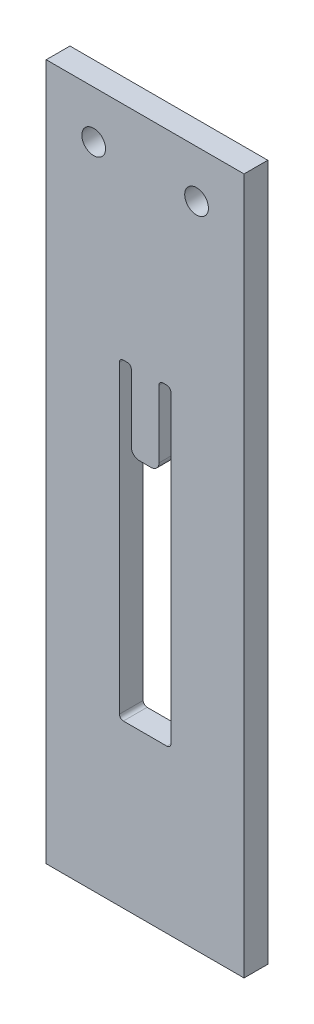
ISO-10303-21;
HEADER;
FILE_DESCRIPTION(('STEP AP214'),'2;1');
FILE_NAME('part.step','',(''),(''),'','','');
FILE_SCHEMA(('AUTOMOTIVE_DESIGN { 1 0 10303 214 1 1 1 1 }'));
ENDSEC;
DATA;
#1=APPLICATION_CONTEXT('core data for automotive mechanical design processes');
#2=APPLICATION_PROTOCOL_DEFINITION('international standard','automotive_design',2000,#1);
#3=PRODUCT_CONTEXT('',#1,'mechanical');
#4=PRODUCT('Part','Part','',(#3));
#5=PRODUCT_RELATED_PRODUCT_CATEGORY('part','',(#4));
#6=PRODUCT_DEFINITION_FORMATION('','',#4);
#7=PRODUCT_DEFINITION_CONTEXT('part definition',#1,'design');
#8=PRODUCT_DEFINITION('design','',#6,#7);
#9=PRODUCT_DEFINITION_SHAPE('','',#8);
#10=(LENGTH_UNIT() NAMED_UNIT(*) SI_UNIT(.MILLI.,.METRE.));
#11=(NAMED_UNIT(*) PLANE_ANGLE_UNIT() SI_UNIT($,.RADIAN.));
#12=(NAMED_UNIT(*) SI_UNIT($,.STERADIAN.) SOLID_ANGLE_UNIT());
#13=UNCERTAINTY_MEASURE_WITH_UNIT(LENGTH_MEASURE(1.E-05),#10,'distance_accuracy_value','');
#14=(GEOMETRIC_REPRESENTATION_CONTEXT(3) GLOBAL_UNCERTAINTY_ASSIGNED_CONTEXT((#13)) GLOBAL_UNIT_ASSIGNED_CONTEXT((#10,
#11,#12)) REPRESENTATION_CONTEXT('',''));
#15=CARTESIAN_POINT('',(0.,0.,0.));
#16=DIRECTION('',(0.,0.,1.));
#17=DIRECTION('',(1.,0.,0.));
#18=AXIS2_PLACEMENT_3D('',#15,#16,#17);
#19=CARTESIAN_POINT('',(0.,0.,3.));
#20=DIRECTION('',(1.,0.,0.));
#21=DIRECTION('',(0.,1.,0.));
#22=AXIS2_PLACEMENT_3D('',#19,#20,#21);
#23=PLANE('',#22);
#24=DIRECTION('',(0.,-1.,0.));
#25=VECTOR('',#24,1.);
#26=CARTESIAN_POINT('',(0.,0.,0.));
#27=LINE('',#26,#25);
#28=CARTESIAN_POINT('',(0.,88.,0.));
#29=VERTEX_POINT('',#28);
#30=CARTESIAN_POINT('',(0.,0.,0.));
#31=VERTEX_POINT('',#30);
#32=EDGE_CURVE('E224',#29,#31,#27,.T.);
#33=ORIENTED_EDGE('',*,*,#32,.T.);
#34=DIRECTION('',(0.,0.,-1.));
#35=VECTOR('',#34,1.);
#36=CARTESIAN_POINT('',(0.,0.,3.));
#37=LINE('',#36,#35);
#38=CARTESIAN_POINT('',(0.,0.,3.));
#39=VERTEX_POINT('',#38);
#40=EDGE_CURVE('E263',#39,#31,#37,.T.);
#41=ORIENTED_EDGE('',*,*,#40,.F.);
#42=DIRECTION('',(0.,-1.,0.));
#43=VECTOR('',#42,1.);
#44=CARTESIAN_POINT('',(0.,0.,3.));
#45=LINE('',#44,#43);
#46=CARTESIAN_POINT('',(0.,88.,3.));
#47=VERTEX_POINT('',#46);
#48=EDGE_CURVE('E230',#47,#39,#45,.T.);
#49=ORIENTED_EDGE('',*,*,#48,.F.);
#50=DIRECTION('',(0.,0.,-1.));
#51=VECTOR('',#50,1.);
#52=CARTESIAN_POINT('',(0.,88.,3.));
#53=LINE('',#52,#51);
#54=EDGE_CURVE('E247',#47,#29,#53,.T.);
#55=ORIENTED_EDGE('',*,*,#54,.T.);
#56=EDGE_LOOP('',(#33,#41,#49,#55));
#57=FACE_BOUND('',#56,.T.);
#58=ADVANCED_FACE('F38',(#57),#23,.F.);
#59=CARTESIAN_POINT('',(0.,0.,3.));
#60=DIRECTION('',(0.,1.,0.));
#61=DIRECTION('',(0.,0.,1.));
#62=AXIS2_PLACEMENT_3D('',#59,#60,#61);
#63=PLANE('',#62);
#64=DIRECTION('',(1.,0.,0.));
#65=VECTOR('',#64,1.);
#66=CARTESIAN_POINT('',(0.,0.,0.));
#67=LINE('',#66,#65);
#68=CARTESIAN_POINT('',(25.,0.,0.));
#69=VERTEX_POINT('',#68);
#70=EDGE_CURVE('E250',#31,#69,#67,.T.);
#71=ORIENTED_EDGE('',*,*,#70,.T.);
#72=DIRECTION('',(0.,0.,-1.));
#73=VECTOR('',#72,1.);
#74=CARTESIAN_POINT('',(25.,0.,3.));
#75=LINE('',#74,#73);
#76=CARTESIAN_POINT('',(25.,0.,3.));
#77=VERTEX_POINT('',#76);
#78=EDGE_CURVE('E260',#77,#69,#75,.T.);
#79=ORIENTED_EDGE('',*,*,#78,.F.);
#80=DIRECTION('',(1.,0.,0.));
#81=VECTOR('',#80,1.);
#82=CARTESIAN_POINT('',(0.,0.,3.));
#83=LINE('',#82,#81);
#84=EDGE_CURVE('E235',#39,#77,#83,.T.);
#85=ORIENTED_EDGE('',*,*,#84,.F.);
#86=ORIENTED_EDGE('',*,*,#40,.T.);
#87=EDGE_LOOP('',(#71,#79,#85,#86));
#88=FACE_BOUND('',#87,.T.);
#89=ADVANCED_FACE('F444',(#88),#63,.F.);
#90=CARTESIAN_POINT('',(25.,0.,3.));
#91=DIRECTION('',(-1.,0.,0.));
#92=DIRECTION('',(0.,-1.,0.));
#93=AXIS2_PLACEMENT_3D('',#90,#91,#92);
#94=PLANE('',#93);
#95=DIRECTION('',(0.,1.,0.));
#96=VECTOR('',#95,1.);
#97=CARTESIAN_POINT('',(25.,0.,0.));
#98=LINE('',#97,#96);
#99=CARTESIAN_POINT('',(25.,88.,0.));
#100=VERTEX_POINT('',#99);
#101=EDGE_CURVE('E252',#69,#100,#98,.T.);
#102=ORIENTED_EDGE('',*,*,#101,.T.);
#103=DIRECTION('',(0.,0.,-1.));
#104=VECTOR('',#103,1.);
#105=CARTESIAN_POINT('',(25.,88.,3.));
#106=LINE('',#105,#104);
#107=CARTESIAN_POINT('',(25.,88.,3.));
#108=VERTEX_POINT('',#107);
#109=EDGE_CURVE('E257',#108,#100,#106,.T.);
#110=ORIENTED_EDGE('',*,*,#109,.F.);
#111=DIRECTION('',(0.,1.,0.));
#112=VECTOR('',#111,1.);
#113=CARTESIAN_POINT('',(25.,0.,3.));
#114=LINE('',#113,#112);
#115=EDGE_CURVE('E240',#77,#108,#114,.T.);
#116=ORIENTED_EDGE('',*,*,#115,.F.);
#117=ORIENTED_EDGE('',*,*,#78,.T.);
#118=EDGE_LOOP('',(#102,#110,#116,#117));
#119=FACE_BOUND('',#118,.T.);
#120=ADVANCED_FACE('F449',(#119),#94,.F.);
#121=CARTESIAN_POINT('',(0.,88.,3.));
#122=DIRECTION('',(0.,-1.,0.));
#123=DIRECTION('',(0.,0.,-1.));
#124=AXIS2_PLACEMENT_3D('',#121,#122,#123);
#125=PLANE('',#124);
#126=DIRECTION('',(-1.,0.,0.));
#127=VECTOR('',#126,1.);
#128=CARTESIAN_POINT('',(0.,88.,0.));
#129=LINE('',#128,#127);
#130=EDGE_CURVE('E236',#100,#29,#129,.T.);
#131=ORIENTED_EDGE('',*,*,#130,.T.);
#132=ORIENTED_EDGE('',*,*,#54,.F.);
#133=DIRECTION('',(-1.,0.,0.));
#134=VECTOR('',#133,1.);
#135=CARTESIAN_POINT('',(0.,88.,3.));
#136=LINE('',#135,#134);
#137=EDGE_CURVE('E243',#108,#47,#136,.T.);
#138=ORIENTED_EDGE('',*,*,#137,.F.);
#139=ORIENTED_EDGE('',*,*,#109,.T.);
#140=EDGE_LOOP('',(#131,#132,#138,#139));
#141=FACE_BOUND('',#140,.T.);
#142=ADVANCED_FACE('F465',(#141),#125,.F.);
#143=CARTESIAN_POINT('',(0.,0.,3.));
#144=DIRECTION('',(0.,0.,-1.));
#145=DIRECTION('',(-1.,0.,0.));
#146=AXIS2_PLACEMENT_3D('',#143,#144,#145);
#147=PLANE('',#146);
#148=DIRECTION('',(0.,1.,0.));
#149=VECTOR('',#148,1.);
#150=CARTESIAN_POINT('',(15.75,21.,3.));
#151=LINE('',#150,#149);
#152=CARTESIAN_POINT('',(15.75,21.,3.));
#153=VERTEX_POINT('',#152);
#154=CARTESIAN_POINT('',(15.75,59.5,3.));
#155=VERTEX_POINT('',#154);
#156=EDGE_CURVE('E185',#153,#155,#151,.T.);
#157=ORIENTED_EDGE('',*,*,#156,.F.);
#158=CARTESIAN_POINT('',(15.25,21.,3.));
#159=DIRECTION('',(0.,0.,1.));
#160=DIRECTION('',(-1.,0.,0.));
#161=AXIS2_PLACEMENT_3D('',#158,#159,#160);
#162=CIRCLE('',#161,0.500000000000001);
#163=CARTESIAN_POINT('',(15.25,20.5,3.));
#164=VERTEX_POINT('',#163);
#165=EDGE_CURVE('E52',#164,#153,#162,.T.);
#166=ORIENTED_EDGE('',*,*,#165,.F.);
#167=DIRECTION('',(1.,0.,0.));
#168=VECTOR('',#167,1.);
#169=CARTESIAN_POINT('',(9.74999999999998,20.5,3.));
#170=LINE('',#169,#168);
#171=CARTESIAN_POINT('',(9.74999999999998,20.5,3.));
#172=VERTEX_POINT('',#171);
#173=EDGE_CURVE('E349',#172,#164,#170,.T.);
#174=ORIENTED_EDGE('',*,*,#173,.F.);
#175=CARTESIAN_POINT('',(9.74999999999998,21.,3.));
#176=DIRECTION('',(0.,0.,1.));
#177=DIRECTION('',(1.,0.,0.));
#178=AXIS2_PLACEMENT_3D('',#175,#176,#177);
#179=CIRCLE('',#178,0.5);
#180=CARTESIAN_POINT('',(9.24999999999998,21.,3.));
#181=VERTEX_POINT('',#180);
#182=EDGE_CURVE('E307',#181,#172,#179,.T.);
#183=ORIENTED_EDGE('',*,*,#182,.F.);
#184=DIRECTION('',(0.,-1.,0.));
#185=VECTOR('',#184,1.);
#186=CARTESIAN_POINT('',(9.24999999999998,21.,3.));
#187=LINE('',#186,#185);
#188=CARTESIAN_POINT('',(9.24999999999998,59.5,3.));
#189=VERTEX_POINT('',#188);
#190=EDGE_CURVE('E354',#189,#181,#187,.T.);
#191=ORIENTED_EDGE('',*,*,#190,.F.);
#192=CARTESIAN_POINT('',(9.74999999999998,59.5,3.));
#193=DIRECTION('',(0.,0.,1.));
#194=DIRECTION('',(-1.,0.,0.));
#195=AXIS2_PLACEMENT_3D('',#192,#193,#194);
#196=CIRCLE('',#195,0.5);
#197=CARTESIAN_POINT('',(9.74999999999998,60.,3.));
#198=VERTEX_POINT('',#197);
#199=EDGE_CURVE('E326',#198,#189,#196,.T.);
#200=ORIENTED_EDGE('',*,*,#199,.F.);
#201=DIRECTION('',(-1.,0.,0.));
#202=VECTOR('',#201,1.);
#203=CARTESIAN_POINT('',(9.74999999999998,60.,3.));
#204=LINE('',#203,#202);
#205=CARTESIAN_POINT('',(10.25,60.,3.));
#206=VERTEX_POINT('',#205);
#207=EDGE_CURVE('E373',#206,#198,#204,.T.);
#208=ORIENTED_EDGE('',*,*,#207,.F.);
#209=CARTESIAN_POINT('',(10.25,59.5,3.));
#210=DIRECTION('',(0.,0.,1.));
#211=DIRECTION('',(-1.,0.,0.));
#212=AXIS2_PLACEMENT_3D('',#209,#210,#211);
#213=CIRCLE('',#212,0.5);
#214=CARTESIAN_POINT('',(10.75,59.5,3.));
#215=VERTEX_POINT('',#214);
#216=EDGE_CURVE('E378',#215,#206,#213,.T.);
#217=ORIENTED_EDGE('',*,*,#216,.F.);
#218=DIRECTION('',(0.,1.,0.));
#219=VECTOR('',#218,1.);
#220=CARTESIAN_POINT('',(10.75,59.5,3.));
#221=LINE('',#220,#219);
#222=CARTESIAN_POINT('',(10.75,51.,3.));
#223=VERTEX_POINT('',#222);
#224=EDGE_CURVE('E386',#223,#215,#221,.T.);
#225=ORIENTED_EDGE('',*,*,#224,.F.);
#226=CARTESIAN_POINT('',(11.75,51.,3.));
#227=DIRECTION('',(0.,0.,-1.));
#228=DIRECTION('',(1.,0.,0.));
#229=AXIS2_PLACEMENT_3D('',#226,#227,#228);
#230=CIRCLE('',#229,0.999999999999999);
#231=CARTESIAN_POINT('',(11.75,50.,3.));
#232=VERTEX_POINT('',#231);
#233=EDGE_CURVE('E390',#232,#223,#230,.T.);
#234=ORIENTED_EDGE('',*,*,#233,.F.);
#235=DIRECTION('',(-1.,0.,0.));
#236=VECTOR('',#235,1.);
#237=CARTESIAN_POINT('',(11.75,50.,3.));
#238=LINE('',#237,#236);
#239=CARTESIAN_POINT('',(13.25,50.,3.));
#240=VERTEX_POINT('',#239);
#241=EDGE_CURVE('E395',#240,#232,#238,.T.);
#242=ORIENTED_EDGE('',*,*,#241,.F.);
#243=CARTESIAN_POINT('',(13.25,51.,3.));
#244=DIRECTION('',(0.,0.,-1.));
#245=DIRECTION('',(1.,0.,0.));
#246=AXIS2_PLACEMENT_3D('',#243,#244,#245);
#247=CIRCLE('',#246,1.);
#248=CARTESIAN_POINT('',(14.25,51.,3.));
#249=VERTEX_POINT('',#248);
#250=EDGE_CURVE('E400',#249,#240,#247,.T.);
#251=ORIENTED_EDGE('',*,*,#250,.F.);
#252=DIRECTION('',(0.,-1.,0.));
#253=VECTOR('',#252,1.);
#254=CARTESIAN_POINT('',(14.25,59.5,3.));
#255=LINE('',#254,#253);
#256=CARTESIAN_POINT('',(14.25,59.5,3.));
#257=VERTEX_POINT('',#256);
#258=EDGE_CURVE('E405',#257,#249,#255,.T.);
#259=ORIENTED_EDGE('',*,*,#258,.F.);
#260=CARTESIAN_POINT('',(14.75,59.5,3.));
#261=DIRECTION('',(0.,0.,1.));
#262=DIRECTION('',(1.,0.,0.));
#263=AXIS2_PLACEMENT_3D('',#260,#261,#262);
#264=CIRCLE('',#263,0.5);
#265=CARTESIAN_POINT('',(14.75,60.,3.));
#266=VERTEX_POINT('',#265);
#267=EDGE_CURVE('E199',#266,#257,#264,.T.);
#268=ORIENTED_EDGE('',*,*,#267,.F.);
#269=DIRECTION('',(-1.,0.,0.));
#270=VECTOR('',#269,1.);
#271=CARTESIAN_POINT('',(14.75,60.,3.));
#272=LINE('',#271,#270);
#273=CARTESIAN_POINT('',(15.25,60.,3.));
#274=VERTEX_POINT('',#273);
#275=EDGE_CURVE('E194',#274,#266,#272,.T.);
#276=ORIENTED_EDGE('',*,*,#275,.F.);
#277=CARTESIAN_POINT('',(15.25,59.5,3.));
#278=DIRECTION('',(0.,0.,1.));
#279=DIRECTION('',(-1.,0.,0.));
#280=AXIS2_PLACEMENT_3D('',#277,#278,#279);
#281=CIRCLE('',#280,0.499999999999997);
#282=EDGE_CURVE('E176',#155,#274,#281,.T.);
#283=ORIENTED_EDGE('',*,*,#282,.F.);
#284=EDGE_LOOP('',(#157,#166,#174,#183,#191,#200,#208,#217,#225,#234,#242,#251,#259,#268,#276,#283));
#285=FACE_BOUND('',#284,.T.);
#286=CARTESIAN_POINT('',(5.99999999999999,82.,3.));
#287=DIRECTION('',(0.,0.,1.));
#288=DIRECTION('',(1.,0.,0.));
#289=AXIS2_PLACEMENT_3D('',#286,#287,#288);
#290=CIRCLE('',#289,1.5);
#291=CARTESIAN_POINT('',(7.49999999999999,82.,3.));
#292=VERTEX_POINT('',#291);
#293=EDGE_CURVE('E214',#292,#292,#290,.T.);
#294=ORIENTED_EDGE('',*,*,#293,.F.);
#295=EDGE_LOOP('',(#294));
#296=FACE_BOUND('',#295,.T.);
#297=CARTESIAN_POINT('',(19.,82.,3.));
#298=DIRECTION('',(0.,0.,1.));
#299=DIRECTION('',(1.,0.,0.));
#300=AXIS2_PLACEMENT_3D('',#297,#298,#299);
#301=CIRCLE('',#300,1.5);
#302=CARTESIAN_POINT('',(20.5,82.,3.));
#303=VERTEX_POINT('',#302);
#304=EDGE_CURVE('E225',#303,#303,#301,.T.);
#305=ORIENTED_EDGE('',*,*,#304,.F.);
#306=EDGE_LOOP('',(#305));
#307=FACE_BOUND('',#306,.T.);
#308=ORIENTED_EDGE('',*,*,#48,.T.);
#309=ORIENTED_EDGE('',*,*,#84,.T.);
#310=ORIENTED_EDGE('',*,*,#115,.T.);
#311=ORIENTED_EDGE('',*,*,#137,.T.);
#312=EDGE_LOOP('',(#308,#309,#310,#311));
#313=FACE_BOUND('',#312,.T.);
#314=ADVANCED_FACE('F190',(#285,#296,#307,#313),#147,.F.);
#315=CARTESIAN_POINT('',(0.,0.,0.));
#316=DIRECTION('',(0.,0.,-1.));
#317=DIRECTION('',(-1.,0.,0.));
#318=AXIS2_PLACEMENT_3D('',#315,#316,#317);
#319=PLANE('',#318);
#320=CARTESIAN_POINT('',(15.25,21.,0.));
#321=DIRECTION('',(0.,0.,-1.));
#322=DIRECTION('',(-1.,0.,0.));
#323=AXIS2_PLACEMENT_3D('',#320,#321,#322);
#324=CIRCLE('',#323,0.500000000000001);
#325=CARTESIAN_POINT('',(15.75,21.,0.));
#326=VERTEX_POINT('',#325);
#327=CARTESIAN_POINT('',(15.25,20.5,0.));
#328=VERTEX_POINT('',#327);
#329=EDGE_CURVE('E12',#326,#328,#324,.T.);
#330=ORIENTED_EDGE('',*,*,#329,.F.);
#331=DIRECTION('',(0.,-1.,0.));
#332=VECTOR('',#331,1.);
#333=CARTESIAN_POINT('',(15.75,0.,0.));
#334=LINE('',#333,#332);
#335=CARTESIAN_POINT('',(15.75,59.5,0.));
#336=VERTEX_POINT('',#335);
#337=EDGE_CURVE('E266',#336,#326,#334,.T.);
#338=ORIENTED_EDGE('',*,*,#337,.F.);
#339=CARTESIAN_POINT('',(15.25,59.5,0.));
#340=DIRECTION('',(0.,0.,-1.));
#341=DIRECTION('',(-1.,0.,0.));
#342=AXIS2_PLACEMENT_3D('',#339,#340,#341);
#343=CIRCLE('',#342,0.499999999999997);
#344=CARTESIAN_POINT('',(15.25,60.,0.));
#345=VERTEX_POINT('',#344);
#346=EDGE_CURVE('E179',#345,#336,#343,.T.);
#347=ORIENTED_EDGE('',*,*,#346,.F.);
#348=DIRECTION('',(1.,0.,0.));
#349=VECTOR('',#348,1.);
#350=CARTESIAN_POINT('',(8.32667268468829E-13,60.0000000000002,0.));
#351=LINE('',#350,#349);
#352=CARTESIAN_POINT('',(14.75,60.,0.));
#353=VERTEX_POINT('',#352);
#354=EDGE_CURVE('E269',#353,#345,#351,.T.);
#355=ORIENTED_EDGE('',*,*,#354,.F.);
#356=CARTESIAN_POINT('',(14.75,59.5,0.));
#357=DIRECTION('',(0.,0.,-1.));
#358=DIRECTION('',(-1.,0.,0.));
#359=AXIS2_PLACEMENT_3D('',#356,#357,#358);
#360=CIRCLE('',#359,0.5);
#361=CARTESIAN_POINT('',(14.25,59.5,0.));
#362=VERTEX_POINT('',#361);
#363=EDGE_CURVE('E271',#362,#353,#360,.T.);
#364=ORIENTED_EDGE('',*,*,#363,.F.);
#365=DIRECTION('',(0.,1.,0.));
#366=VECTOR('',#365,1.);
#367=CARTESIAN_POINT('',(14.25,0.,0.));
#368=LINE('',#367,#366);
#369=CARTESIAN_POINT('',(14.25,51.,0.));
#370=VERTEX_POINT('',#369);
#371=EDGE_CURVE('E273',#370,#362,#368,.T.);
#372=ORIENTED_EDGE('',*,*,#371,.F.);
#373=CARTESIAN_POINT('',(13.25,51.,0.));
#374=DIRECTION('',(0.,0.,-1.));
#375=DIRECTION('',(-1.,0.,0.));
#376=AXIS2_PLACEMENT_3D('',#373,#374,#375);
#377=CIRCLE('',#376,1.);
#378=CARTESIAN_POINT('',(13.25,50.,0.));
#379=VERTEX_POINT('',#378);
#380=EDGE_CURVE('E275',#379,#370,#377,.F.);
#381=ORIENTED_EDGE('',*,*,#380,.F.);
#382=DIRECTION('',(1.,0.,0.));
#383=VECTOR('',#382,1.);
#384=CARTESIAN_POINT('',(0.,50.,0.));
#385=LINE('',#384,#383);
#386=CARTESIAN_POINT('',(11.75,50.,0.));
#387=VERTEX_POINT('',#386);
#388=EDGE_CURVE('E277',#387,#379,#385,.T.);
#389=ORIENTED_EDGE('',*,*,#388,.F.);
#390=CARTESIAN_POINT('',(11.75,51.,0.));
#391=DIRECTION('',(0.,0.,-1.));
#392=DIRECTION('',(-1.,0.,0.));
#393=AXIS2_PLACEMENT_3D('',#390,#391,#392);
#394=CIRCLE('',#393,0.999999999999999);
#395=CARTESIAN_POINT('',(10.75,51.,0.));
#396=VERTEX_POINT('',#395);
#397=EDGE_CURVE('E279',#396,#387,#394,.F.);
#398=ORIENTED_EDGE('',*,*,#397,.F.);
#399=DIRECTION('',(0.,-1.,0.));
#400=VECTOR('',#399,1.);
#401=CARTESIAN_POINT('',(10.75,0.,0.));
#402=LINE('',#401,#400);
#403=CARTESIAN_POINT('',(10.75,59.5,0.));
#404=VERTEX_POINT('',#403);
#405=EDGE_CURVE('E281',#404,#396,#402,.T.);
#406=ORIENTED_EDGE('',*,*,#405,.F.);
#407=CARTESIAN_POINT('',(10.25,59.5,0.));
#408=DIRECTION('',(0.,0.,-1.));
#409=DIRECTION('',(-1.,0.,0.));
#410=AXIS2_PLACEMENT_3D('',#407,#408,#409);
#411=CIRCLE('',#410,0.5);
#412=CARTESIAN_POINT('',(10.25,60.,0.));
#413=VERTEX_POINT('',#412);
#414=EDGE_CURVE('E283',#413,#404,#411,.T.);
#415=ORIENTED_EDGE('',*,*,#414,.F.);
#416=DIRECTION('',(1.,0.,0.));
#417=VECTOR('',#416,1.);
#418=CARTESIAN_POINT('',(0.,60.,0.));
#419=LINE('',#418,#417);
#420=CARTESIAN_POINT('',(9.74999999999998,60.,0.));
#421=VERTEX_POINT('',#420);
#422=EDGE_CURVE('E285',#421,#413,#419,.T.);
#423=ORIENTED_EDGE('',*,*,#422,.F.);
#424=CARTESIAN_POINT('',(9.74999999999998,59.5,0.));
#425=DIRECTION('',(0.,0.,-1.));
#426=DIRECTION('',(-1.,0.,0.));
#427=AXIS2_PLACEMENT_3D('',#424,#425,#426);
#428=CIRCLE('',#427,0.5);
#429=CARTESIAN_POINT('',(9.24999999999998,59.5,0.));
#430=VERTEX_POINT('',#429);
#431=EDGE_CURVE('E287',#430,#421,#428,.T.);
#432=ORIENTED_EDGE('',*,*,#431,.F.);
#433=DIRECTION('',(0.,1.,0.));
#434=VECTOR('',#433,1.);
#435=CARTESIAN_POINT('',(9.24999999999998,0.,0.));
#436=LINE('',#435,#434);
#437=CARTESIAN_POINT('',(9.24999999999998,21.,0.));
#438=VERTEX_POINT('',#437);
#439=EDGE_CURVE('E289',#438,#430,#436,.T.);
#440=ORIENTED_EDGE('',*,*,#439,.F.);
#441=CARTESIAN_POINT('',(9.74999999999998,21.,0.));
#442=DIRECTION('',(0.,0.,-1.));
#443=DIRECTION('',(-1.,0.,0.));
#444=AXIS2_PLACEMENT_3D('',#441,#442,#443);
#445=CIRCLE('',#444,0.5);
#446=CARTESIAN_POINT('',(9.74999999999998,20.5,0.));
#447=VERTEX_POINT('',#446);
#448=EDGE_CURVE('E291',#447,#438,#445,.T.);
#449=ORIENTED_EDGE('',*,*,#448,.F.);
#450=DIRECTION('',(-1.,0.,0.));
#451=VECTOR('',#450,1.);
#452=CARTESIAN_POINT('',(0.,20.5,0.));
#453=LINE('',#452,#451);
#454=EDGE_CURVE('E45',#328,#447,#453,.T.);
#455=ORIENTED_EDGE('',*,*,#454,.F.);
#456=EDGE_LOOP('',(#330,#338,#347,#355,#364,#372,#381,#389,#398,#406,#415,#423,#432,#440,#449,#455));
#457=FACE_BOUND('',#456,.T.);
#458=CARTESIAN_POINT('',(5.99999999999999,82.,0.));
#459=DIRECTION('',(0.,0.,1.));
#460=DIRECTION('',(1.,0.,0.));
#461=AXIS2_PLACEMENT_3D('',#458,#459,#460);
#462=CIRCLE('',#461,1.5);
#463=CARTESIAN_POINT('',(7.49999999999999,82.,0.));
#464=VERTEX_POINT('',#463);
#465=EDGE_CURVE('E219',#464,#464,#462,.T.);
#466=ORIENTED_EDGE('',*,*,#465,.T.);
#467=EDGE_LOOP('',(#466));
#468=FACE_BOUND('',#467,.T.);
#469=CARTESIAN_POINT('',(19.,82.,0.));
#470=DIRECTION('',(0.,0.,1.));
#471=DIRECTION('',(1.,0.,0.));
#472=AXIS2_PLACEMENT_3D('',#469,#470,#471);
#473=CIRCLE('',#472,1.5);
#474=CARTESIAN_POINT('',(20.5,82.,0.));
#475=VERTEX_POINT('',#474);
#476=EDGE_CURVE('E222',#475,#475,#473,.T.);
#477=ORIENTED_EDGE('',*,*,#476,.T.);
#478=EDGE_LOOP('',(#477));
#479=FACE_BOUND('',#478,.T.);
#480=ORIENTED_EDGE('',*,*,#32,.F.);
#481=ORIENTED_EDGE('',*,*,#130,.F.);
#482=ORIENTED_EDGE('',*,*,#101,.F.);
#483=ORIENTED_EDGE('',*,*,#70,.F.);
#484=EDGE_LOOP('',(#480,#481,#482,#483));
#485=FACE_BOUND('',#484,.T.);
#486=ADVANCED_FACE('F312',(#457,#468,#479,#485),#319,.T.);
#487=CARTESIAN_POINT('',(19.,82.,0.));
#488=DIRECTION('',(0.,0.,1.));
#489=DIRECTION('',(1.,0.,0.));
#490=AXIS2_PLACEMENT_3D('',#487,#488,#489);
#491=CYLINDRICAL_SURFACE('',#490,1.5);
#492=ORIENTED_EDGE('',*,*,#476,.F.);
#493=EDGE_LOOP('',(#492));
#494=FACE_BOUND('',#493,.T.);
#495=ORIENTED_EDGE('',*,*,#304,.T.);
#496=EDGE_LOOP('',(#495));
#497=FACE_BOUND('',#496,.T.);
#498=ADVANCED_FACE('F439',(#494,#497),#491,.F.);
#499=CARTESIAN_POINT('',(5.99999999999999,82.,0.));
#500=DIRECTION('',(0.,0.,1.));
#501=DIRECTION('',(1.,0.,0.));
#502=AXIS2_PLACEMENT_3D('',#499,#500,#501);
#503=CYLINDRICAL_SURFACE('',#502,1.5);
#504=ORIENTED_EDGE('',*,*,#465,.F.);
#505=EDGE_LOOP('',(#504));
#506=FACE_BOUND('',#505,.T.);
#507=ORIENTED_EDGE('',*,*,#293,.T.);
#508=EDGE_LOOP('',(#507));
#509=FACE_BOUND('',#508,.T.);
#510=ADVANCED_FACE('F432',(#506,#509),#503,.F.);
#511=CARTESIAN_POINT('',(15.25,21.,-7.));
#512=DIRECTION('',(0.,0.,1.));
#513=DIRECTION('',(1.,0.,0.));
#514=AXIS2_PLACEMENT_3D('',#511,#512,#513);
#515=CYLINDRICAL_SURFACE('',#514,0.500000000000001);
#516=ORIENTED_EDGE('',*,*,#329,.T.);
#517=DIRECTION('',(0.,0.,1.));
#518=VECTOR('',#517,1.);
#519=CARTESIAN_POINT('',(15.25,20.5,-7.));
#520=LINE('',#519,#518);
#521=EDGE_CURVE('E220',#328,#164,#520,.T.);
#522=ORIENTED_EDGE('',*,*,#521,.T.);
#523=ORIENTED_EDGE('',*,*,#165,.T.);
#524=DIRECTION('',(0.,0.,1.));
#525=VECTOR('',#524,1.);
#526=CARTESIAN_POINT('',(15.75,21.,-7.));
#527=LINE('',#526,#525);
#528=EDGE_CURVE('E182',#326,#153,#527,.T.);
#529=ORIENTED_EDGE('',*,*,#528,.F.);
#530=EDGE_LOOP('',(#516,#522,#523,#529));
#531=FACE_BOUND('',#530,.T.);
#532=ADVANCED_FACE('F430',(#531),#515,.F.);
#533=CARTESIAN_POINT('',(9.74999999999998,20.5,-7.));
#534=DIRECTION('',(0.,-1.,0.));
#535=DIRECTION('',(0.,0.,-1.));
#536=AXIS2_PLACEMENT_3D('',#533,#534,#535);
#537=PLANE('',#536);
#538=ORIENTED_EDGE('',*,*,#454,.T.);
#539=DIRECTION('',(0.,0.,1.));
#540=VECTOR('',#539,1.);
#541=CARTESIAN_POINT('',(9.74999999999998,20.5,-7.));
#542=LINE('',#541,#540);
#543=EDGE_CURVE('E298',#447,#172,#542,.T.);
#544=ORIENTED_EDGE('',*,*,#543,.T.);
#545=ORIENTED_EDGE('',*,*,#173,.T.);
#546=ORIENTED_EDGE('',*,*,#521,.F.);
#547=EDGE_LOOP('',(#538,#544,#545,#546));
#548=FACE_BOUND('',#547,.T.);
#549=ADVANCED_FACE('F296',(#548),#537,.F.);
#550=CARTESIAN_POINT('',(9.74999999999998,21.,-7.));
#551=DIRECTION('',(0.,0.,1.));
#552=DIRECTION('',(1.,0.,0.));
#553=AXIS2_PLACEMENT_3D('',#550,#551,#552);
#554=CYLINDRICAL_SURFACE('',#553,0.5);
#555=ORIENTED_EDGE('',*,*,#448,.T.);
#556=DIRECTION('',(0.,0.,1.));
#557=VECTOR('',#556,1.);
#558=CARTESIAN_POINT('',(9.24999999999998,21.,-7.));
#559=LINE('',#558,#557);
#560=EDGE_CURVE('E309',#438,#181,#559,.T.);
#561=ORIENTED_EDGE('',*,*,#560,.T.);
#562=ORIENTED_EDGE('',*,*,#182,.T.);
#563=ORIENTED_EDGE('',*,*,#543,.F.);
#564=EDGE_LOOP('',(#555,#561,#562,#563));
#565=FACE_BOUND('',#564,.T.);
#566=ADVANCED_FACE('F304',(#565),#554,.F.);
#567=CARTESIAN_POINT('',(9.24999999999998,21.,-7.));
#568=DIRECTION('',(-1.,0.,0.));
#569=DIRECTION('',(0.,-1.,0.));
#570=AXIS2_PLACEMENT_3D('',#567,#568,#569);
#571=PLANE('',#570);
#572=ORIENTED_EDGE('',*,*,#439,.T.);
#573=DIRECTION('',(0.,0.,1.));
#574=VECTOR('',#573,1.);
#575=CARTESIAN_POINT('',(9.24999999999998,59.5,-7.));
#576=LINE('',#575,#574);
#577=EDGE_CURVE('E320',#430,#189,#576,.T.);
#578=ORIENTED_EDGE('',*,*,#577,.T.);
#579=ORIENTED_EDGE('',*,*,#190,.T.);
#580=ORIENTED_EDGE('',*,*,#560,.F.);
#581=EDGE_LOOP('',(#572,#578,#579,#580));
#582=FACE_BOUND('',#581,.T.);
#583=ADVANCED_FACE('F318',(#582),#571,.F.);
#584=CARTESIAN_POINT('',(9.74999999999998,59.5,-7.));
#585=DIRECTION('',(0.,0.,1.));
#586=DIRECTION('',(1.,0.,0.));
#587=AXIS2_PLACEMENT_3D('',#584,#585,#586);
#588=CYLINDRICAL_SURFACE('',#587,0.5);
#589=ORIENTED_EDGE('',*,*,#431,.T.);
#590=DIRECTION('',(0.,0.,1.));
#591=VECTOR('',#590,1.);
#592=CARTESIAN_POINT('',(9.74999999999998,60.,-7.));
#593=LINE('',#592,#591);
#594=EDGE_CURVE('E328',#421,#198,#593,.T.);
#595=ORIENTED_EDGE('',*,*,#594,.T.);
#596=ORIENTED_EDGE('',*,*,#199,.T.);
#597=ORIENTED_EDGE('',*,*,#577,.F.);
#598=EDGE_LOOP('',(#589,#595,#596,#597));
#599=FACE_BOUND('',#598,.T.);
#600=ADVANCED_FACE('F323',(#599),#588,.F.);
#601=CARTESIAN_POINT('',(9.74999999999998,60.,-7.));
#602=DIRECTION('',(0.,1.,0.));
#603=DIRECTION('',(0.,0.,1.));
#604=AXIS2_PLACEMENT_3D('',#601,#602,#603);
#605=PLANE('',#604);
#606=ORIENTED_EDGE('',*,*,#422,.T.);
#607=DIRECTION('',(0.,0.,1.));
#608=VECTOR('',#607,1.);
#609=CARTESIAN_POINT('',(10.25,60.,-7.));
#610=LINE('',#609,#608);
#611=EDGE_CURVE('E331',#413,#206,#610,.T.);
#612=ORIENTED_EDGE('',*,*,#611,.T.);
#613=ORIENTED_EDGE('',*,*,#207,.T.);
#614=ORIENTED_EDGE('',*,*,#594,.F.);
#615=EDGE_LOOP('',(#606,#612,#613,#614));
#616=FACE_BOUND('',#615,.T.);
#617=ADVANCED_FACE('F540',(#616),#605,.F.);
#618=CARTESIAN_POINT('',(10.25,59.5,-7.));
#619=DIRECTION('',(0.,0.,1.));
#620=DIRECTION('',(1.,0.,0.));
#621=AXIS2_PLACEMENT_3D('',#618,#619,#620);
#622=CYLINDRICAL_SURFACE('',#621,0.5);
#623=ORIENTED_EDGE('',*,*,#414,.T.);
#624=DIRECTION('',(0.,0.,1.));
#625=VECTOR('',#624,1.);
#626=CARTESIAN_POINT('',(10.75,59.5,-7.));
#627=LINE('',#626,#625);
#628=EDGE_CURVE('E335',#404,#215,#627,.T.);
#629=ORIENTED_EDGE('',*,*,#628,.T.);
#630=ORIENTED_EDGE('',*,*,#216,.T.);
#631=ORIENTED_EDGE('',*,*,#611,.F.);
#632=EDGE_LOOP('',(#623,#629,#630,#631));
#633=FACE_BOUND('',#632,.T.);
#634=ADVANCED_FACE('F549',(#633),#622,.F.);
#635=CARTESIAN_POINT('',(10.75,59.5,-7.));
#636=DIRECTION('',(1.,0.,0.));
#637=DIRECTION('',(0.,1.,0.));
#638=AXIS2_PLACEMENT_3D('',#635,#636,#637);
#639=PLANE('',#638);
#640=ORIENTED_EDGE('',*,*,#405,.T.);
#641=DIRECTION('',(0.,0.,1.));
#642=VECTOR('',#641,1.);
#643=CARTESIAN_POINT('',(10.75,51.,-7.));
#644=LINE('',#643,#642);
#645=EDGE_CURVE('E337',#396,#223,#644,.T.);
#646=ORIENTED_EDGE('',*,*,#645,.T.);
#647=ORIENTED_EDGE('',*,*,#224,.T.);
#648=ORIENTED_EDGE('',*,*,#628,.F.);
#649=EDGE_LOOP('',(#640,#646,#647,#648));
#650=FACE_BOUND('',#649,.T.);
#651=ADVANCED_FACE('F559',(#650),#639,.F.);
#652=CARTESIAN_POINT('',(11.75,51.,-7.));
#653=DIRECTION('',(0.,0.,1.));
#654=DIRECTION('',(1.,0.,0.));
#655=AXIS2_PLACEMENT_3D('',#652,#653,#654);
#656=CYLINDRICAL_SURFACE('',#655,0.999999999999999);
#657=ORIENTED_EDGE('',*,*,#397,.T.);
#658=DIRECTION('',(0.,0.,1.));
#659=VECTOR('',#658,1.);
#660=CARTESIAN_POINT('',(11.75,50.,-7.));
#661=LINE('',#660,#659);
#662=EDGE_CURVE('E339',#387,#232,#661,.T.);
#663=ORIENTED_EDGE('',*,*,#662,.T.);
#664=ORIENTED_EDGE('',*,*,#233,.T.);
#665=ORIENTED_EDGE('',*,*,#645,.F.);
#666=EDGE_LOOP('',(#657,#663,#664,#665));
#667=FACE_BOUND('',#666,.T.);
#668=ADVANCED_FACE('F569',(#667),#656,.T.);
#669=CARTESIAN_POINT('',(11.75,50.,-7.));
#670=DIRECTION('',(0.,1.,0.));
#671=DIRECTION('',(0.,0.,1.));
#672=AXIS2_PLACEMENT_3D('',#669,#670,#671);
#673=PLANE('',#672);
#674=ORIENTED_EDGE('',*,*,#388,.T.);
#675=DIRECTION('',(0.,0.,1.));
#676=VECTOR('',#675,1.);
#677=CARTESIAN_POINT('',(13.25,50.,-7.));
#678=LINE('',#677,#676);
#679=EDGE_CURVE('E341',#379,#240,#678,.T.);
#680=ORIENTED_EDGE('',*,*,#679,.T.);
#681=ORIENTED_EDGE('',*,*,#241,.T.);
#682=ORIENTED_EDGE('',*,*,#662,.F.);
#683=EDGE_LOOP('',(#674,#680,#681,#682));
#684=FACE_BOUND('',#683,.T.);
#685=ADVANCED_FACE('F579',(#684),#673,.F.);
#686=CARTESIAN_POINT('',(13.25,51.,-7.));
#687=DIRECTION('',(0.,0.,1.));
#688=DIRECTION('',(1.,0.,0.));
#689=AXIS2_PLACEMENT_3D('',#686,#687,#688);
#690=CYLINDRICAL_SURFACE('',#689,1.);
#691=ORIENTED_EDGE('',*,*,#380,.T.);
#692=DIRECTION('',(0.,0.,1.));
#693=VECTOR('',#692,1.);
#694=CARTESIAN_POINT('',(14.25,51.,-7.));
#695=LINE('',#694,#693);
#696=EDGE_CURVE('E343',#370,#249,#695,.T.);
#697=ORIENTED_EDGE('',*,*,#696,.T.);
#698=ORIENTED_EDGE('',*,*,#250,.T.);
#699=ORIENTED_EDGE('',*,*,#679,.F.);
#700=EDGE_LOOP('',(#691,#697,#698,#699));
#701=FACE_BOUND('',#700,.T.);
#702=ADVANCED_FACE('F589',(#701),#690,.T.);
#703=CARTESIAN_POINT('',(14.25,59.5,-7.));
#704=DIRECTION('',(-1.,0.,0.));
#705=DIRECTION('',(0.,0.,1.));
#706=AXIS2_PLACEMENT_3D('',#703,#704,#705);
#707=PLANE('',#706);
#708=ORIENTED_EDGE('',*,*,#371,.T.);
#709=DIRECTION('',(0.,0.,1.));
#710=VECTOR('',#709,1.);
#711=CARTESIAN_POINT('',(14.25,59.5,-7.));
#712=LINE('',#711,#710);
#713=EDGE_CURVE('E345',#362,#257,#712,.T.);
#714=ORIENTED_EDGE('',*,*,#713,.T.);
#715=ORIENTED_EDGE('',*,*,#258,.T.);
#716=ORIENTED_EDGE('',*,*,#696,.F.);
#717=EDGE_LOOP('',(#708,#714,#715,#716));
#718=FACE_BOUND('',#717,.T.);
#719=ADVANCED_FACE('F423',(#718),#707,.F.);
#720=CARTESIAN_POINT('',(14.75,59.5,-7.));
#721=DIRECTION('',(0.,0.,1.));
#722=DIRECTION('',(1.,0.,0.));
#723=AXIS2_PLACEMENT_3D('',#720,#721,#722);
#724=CYLINDRICAL_SURFACE('',#723,0.5);
#725=ORIENTED_EDGE('',*,*,#363,.T.);
#726=DIRECTION('',(0.,0.,1.));
#727=VECTOR('',#726,1.);
#728=CARTESIAN_POINT('',(14.75,60.,-7.));
#729=LINE('',#728,#727);
#730=EDGE_CURVE('E347',#353,#266,#729,.T.);
#731=ORIENTED_EDGE('',*,*,#730,.T.);
#732=ORIENTED_EDGE('',*,*,#267,.T.);
#733=ORIENTED_EDGE('',*,*,#713,.F.);
#734=EDGE_LOOP('',(#725,#731,#732,#733));
#735=FACE_BOUND('',#734,.T.);
#736=ADVANCED_FACE('F415',(#735),#724,.F.);
#737=CARTESIAN_POINT('',(14.75,60.,-7.));
#738=DIRECTION('',(0.,1.,0.));
#739=DIRECTION('',(-1.,0.,0.));
#740=AXIS2_PLACEMENT_3D('',#737,#738,#739);
#741=PLANE('',#740);
#742=ORIENTED_EDGE('',*,*,#354,.T.);
#743=DIRECTION('',(0.,0.,1.));
#744=VECTOR('',#743,1.);
#745=CARTESIAN_POINT('',(15.25,60.,-7.));
#746=LINE('',#745,#744);
#747=EDGE_CURVE('E181',#345,#274,#746,.T.);
#748=ORIENTED_EDGE('',*,*,#747,.T.);
#749=ORIENTED_EDGE('',*,*,#275,.T.);
#750=ORIENTED_EDGE('',*,*,#730,.F.);
#751=EDGE_LOOP('',(#742,#748,#749,#750));
#752=FACE_BOUND('',#751,.T.);
#753=ADVANCED_FACE('F429',(#752),#741,.F.);
#754=CARTESIAN_POINT('',(15.25,59.5,-7.));
#755=DIRECTION('',(0.,0.,1.));
#756=DIRECTION('',(1.,0.,0.));
#757=AXIS2_PLACEMENT_3D('',#754,#755,#756);
#758=CYLINDRICAL_SURFACE('',#757,0.499999999999997);
#759=ORIENTED_EDGE('',*,*,#346,.T.);
#760=DIRECTION('',(0.,0.,1.));
#761=VECTOR('',#760,1.);
#762=CARTESIAN_POINT('',(15.75,59.5,-7.));
#763=LINE('',#762,#761);
#764=EDGE_CURVE('E60',#336,#155,#763,.T.);
#765=ORIENTED_EDGE('',*,*,#764,.T.);
#766=ORIENTED_EDGE('',*,*,#282,.T.);
#767=ORIENTED_EDGE('',*,*,#747,.F.);
#768=EDGE_LOOP('',(#759,#765,#766,#767));
#769=FACE_BOUND('',#768,.T.);
#770=ADVANCED_FACE('F173',(#769),#758,.F.);
#771=CARTESIAN_POINT('',(15.75,21.,-7.));
#772=DIRECTION('',(1.,0.,0.));
#773=DIRECTION('',(0.,0.,-1.));
#774=AXIS2_PLACEMENT_3D('',#771,#772,#773);
#775=PLANE('',#774);
#776=ORIENTED_EDGE('',*,*,#337,.T.);
#777=ORIENTED_EDGE('',*,*,#528,.T.);
#778=ORIENTED_EDGE('',*,*,#156,.T.);
#779=ORIENTED_EDGE('',*,*,#764,.F.);
#780=EDGE_LOOP('',(#776,#777,#778,#779));
#781=FACE_BOUND('',#780,.T.);
#782=ADVANCED_FACE('F186',(#781),#775,.F.);
#783=CLOSED_SHELL('',(#58,#89,#120,#142,#314,#486,#498,#510,#532,#549,#566,#583,#600,#617,#634,
#651,#668,#685,#702,#719,#736,#753,#770,#782));
#784=MANIFOLD_SOLID_BREP('B2',#783);
#785=ADVANCED_BREP_SHAPE_REPRESENTATION('',(#18,#784),#14);
#786=SHAPE_DEFINITION_REPRESENTATION(#9,#785);
ENDSEC;
END-ISO-10303-21;
